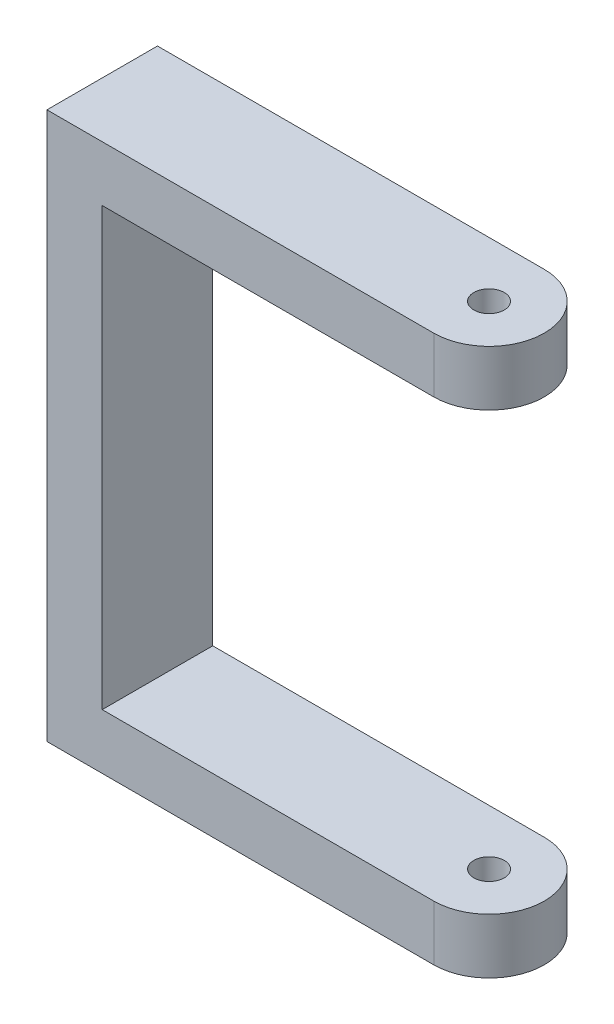
ISO-10303-21;
HEADER;
FILE_DESCRIPTION(('STEP AP214'),'2;1');
FILE_NAME('part.step','',(''),(''),'','','');
FILE_SCHEMA(('AUTOMOTIVE_DESIGN { 1 0 10303 214 1 1 1 1 }'));
ENDSEC;
DATA;
#1=APPLICATION_CONTEXT('core data for automotive mechanical design processes');
#2=APPLICATION_PROTOCOL_DEFINITION('international standard','automotive_design',2000,#1);
#3=PRODUCT_CONTEXT('',#1,'mechanical');
#4=PRODUCT('Part','Part','',(#3));
#5=PRODUCT_RELATED_PRODUCT_CATEGORY('part','',(#4));
#6=PRODUCT_DEFINITION_FORMATION('','',#4);
#7=PRODUCT_DEFINITION_CONTEXT('part definition',#1,'design');
#8=PRODUCT_DEFINITION('design','',#6,#7);
#9=PRODUCT_DEFINITION_SHAPE('','',#8);
#10=(LENGTH_UNIT() NAMED_UNIT(*) SI_UNIT(.MILLI.,.METRE.));
#11=(NAMED_UNIT(*) PLANE_ANGLE_UNIT() SI_UNIT($,.RADIAN.));
#12=(NAMED_UNIT(*) SI_UNIT($,.STERADIAN.) SOLID_ANGLE_UNIT());
#13=UNCERTAINTY_MEASURE_WITH_UNIT(LENGTH_MEASURE(1.E-05),#10,'distance_accuracy_value','');
#14=(GEOMETRIC_REPRESENTATION_CONTEXT(3) GLOBAL_UNCERTAINTY_ASSIGNED_CONTEXT((#13)) GLOBAL_UNIT_ASSIGNED_CONTEXT((#10,
#11,#12)) REPRESENTATION_CONTEXT('',''));
#15=CARTESIAN_POINT('',(0.,0.,0.));
#16=DIRECTION('',(0.,0.,1.));
#17=DIRECTION('',(1.,0.,0.));
#18=AXIS2_PLACEMENT_3D('',#15,#16,#17);
#19=CARTESIAN_POINT('',(70.,49.5,20.));
#20=DIRECTION('',(0.,-1.,0.));
#21=DIRECTION('',(1.,0.,0.));
#22=AXIS2_PLACEMENT_3D('',#19,#20,#21);
#23=PLANE('',#22);
#24=CARTESIAN_POINT('',(60.,49.5,10.));
#25=DIRECTION('',(0.,1.,0.));
#26=DIRECTION('',(-1.,0.,0.));
#27=AXIS2_PLACEMENT_3D('',#24,#25,#26);
#28=CIRCLE('',#27,2.75);
#29=CARTESIAN_POINT('',(57.25,49.5,10.));
#30=VERTEX_POINT('',#29);
#31=EDGE_CURVE('E220',#30,#30,#28,.T.);
#32=ORIENTED_EDGE('',*,*,#31,.F.);
#33=EDGE_LOOP('',(#32));
#34=FACE_BOUND('',#33,.T.);
#35=DIRECTION('',(-1.,0.,0.));
#36=VECTOR('',#35,1.);
#37=CARTESIAN_POINT('',(70.,49.5,20.));
#38=LINE('',#37,#36);
#39=CARTESIAN_POINT('',(60.,49.5,20.));
#40=VERTEX_POINT('',#39);
#41=CARTESIAN_POINT('',(-9.99999999999999,49.5,20.));
#42=VERTEX_POINT('',#41);
#43=EDGE_CURVE('E166',#40,#42,#38,.T.);
#44=ORIENTED_EDGE('',*,*,#43,.F.);
#45=CARTESIAN_POINT('',(60.,49.5,10.));
#46=DIRECTION('',(0.,1.,0.));
#47=DIRECTION('',(-1.,0.,0.));
#48=AXIS2_PLACEMENT_3D('',#45,#46,#47);
#49=CIRCLE('',#48,10.);
#50=CARTESIAN_POINT('',(60.,49.5,0.));
#51=VERTEX_POINT('',#50);
#52=EDGE_CURVE('E148',#40,#51,#49,.T.);
#53=ORIENTED_EDGE('',*,*,#52,.T.);
#54=DIRECTION('',(-1.,0.,0.));
#55=VECTOR('',#54,1.);
#56=CARTESIAN_POINT('',(70.,49.5,0.));
#57=LINE('',#56,#55);
#58=CARTESIAN_POINT('',(-9.99999999999999,49.5,0.));
#59=VERTEX_POINT('',#58);
#60=EDGE_CURVE('E175',#51,#59,#57,.T.);
#61=ORIENTED_EDGE('',*,*,#60,.T.);
#62=DIRECTION('',(0.,0.,-1.));
#63=VECTOR('',#62,1.);
#64=CARTESIAN_POINT('',(-9.99999999999999,49.5,20.));
#65=LINE('',#64,#63);
#66=EDGE_CURVE('E195',#42,#59,#65,.T.);
#67=ORIENTED_EDGE('',*,*,#66,.F.);
#68=EDGE_LOOP('',(#44,#53,#61,#67));
#69=FACE_BOUND('',#68,.T.);
#70=ADVANCED_FACE('F77',(#34,#69),#23,.F.);
#71=CARTESIAN_POINT('',(-9.99999999999999,-49.5,20.));
#72=DIRECTION('',(0.,1.,0.));
#73=DIRECTION('',(-1.,0.,0.));
#74=AXIS2_PLACEMENT_3D('',#71,#72,#73);
#75=PLANE('',#74);
#76=CARTESIAN_POINT('',(60.,-49.5,10.));
#77=DIRECTION('',(0.,1.,0.));
#78=DIRECTION('',(-1.,0.,0.));
#79=AXIS2_PLACEMENT_3D('',#76,#77,#78);
#80=CIRCLE('',#79,2.75);
#81=CARTESIAN_POINT('',(57.25,-49.5,10.));
#82=VERTEX_POINT('',#81);
#83=EDGE_CURVE('E205',#82,#82,#80,.T.);
#84=ORIENTED_EDGE('',*,*,#83,.T.);
#85=EDGE_LOOP('',(#84));
#86=FACE_BOUND('',#85,.T.);
#87=CARTESIAN_POINT('',(60.,-49.5,10.));
#88=DIRECTION('',(0.,1.,0.));
#89=DIRECTION('',(-1.,0.,0.));
#90=AXIS2_PLACEMENT_3D('',#87,#88,#89);
#91=CIRCLE('',#90,10.);
#92=CARTESIAN_POINT('',(60.,-49.5,20.));
#93=VERTEX_POINT('',#92);
#94=CARTESIAN_POINT('',(60.,-49.5,0.));
#95=VERTEX_POINT('',#94);
#96=EDGE_CURVE('E91',#93,#95,#91,.T.);
#97=ORIENTED_EDGE('',*,*,#96,.F.);
#98=DIRECTION('',(1.,0.,0.));
#99=VECTOR('',#98,1.);
#100=CARTESIAN_POINT('',(-9.99999999999999,-49.5,20.));
#101=LINE('',#100,#99);
#102=CARTESIAN_POINT('',(-9.99999999999999,-49.5,20.));
#103=VERTEX_POINT('',#102);
#104=EDGE_CURVE('E144',#103,#93,#101,.T.);
#105=ORIENTED_EDGE('',*,*,#104,.F.);
#106=DIRECTION('',(0.,0.,-1.));
#107=VECTOR('',#106,1.);
#108=CARTESIAN_POINT('',(-9.99999999999999,-49.5,20.));
#109=LINE('',#108,#107);
#110=CARTESIAN_POINT('',(-9.99999999999999,-49.5,0.));
#111=VERTEX_POINT('',#110);
#112=EDGE_CURVE('E193',#103,#111,#109,.T.);
#113=ORIENTED_EDGE('',*,*,#112,.T.);
#114=DIRECTION('',(1.,0.,0.));
#115=VECTOR('',#114,1.);
#116=CARTESIAN_POINT('',(-9.99999999999999,-49.5,0.));
#117=LINE('',#116,#115);
#118=EDGE_CURVE('E146',#111,#95,#117,.T.);
#119=ORIENTED_EDGE('',*,*,#118,.T.);
#120=EDGE_LOOP('',(#97,#105,#113,#119));
#121=FACE_BOUND('',#120,.T.);
#122=ADVANCED_FACE('F141',(#86,#121),#75,.F.);
#123=CARTESIAN_POINT('',(70.,-39.5,20.));
#124=DIRECTION('',(0.,-1.,0.));
#125=DIRECTION('',(1.,0.,0.));
#126=AXIS2_PLACEMENT_3D('',#123,#124,#125);
#127=PLANE('',#126);
#128=CARTESIAN_POINT('',(60.,-39.5,10.));
#129=DIRECTION('',(0.,-1.,0.));
#130=DIRECTION('',(1.,0.,0.));
#131=AXIS2_PLACEMENT_3D('',#128,#129,#130);
#132=CIRCLE('',#131,2.75);
#133=CARTESIAN_POINT('',(62.75,-39.5,10.));
#134=VERTEX_POINT('',#133);
#135=EDGE_CURVE('E178',#134,#134,#132,.T.);
#136=ORIENTED_EDGE('',*,*,#135,.T.);
#137=EDGE_LOOP('',(#136));
#138=FACE_BOUND('',#137,.T.);
#139=DIRECTION('',(-1.,0.,0.));
#140=VECTOR('',#139,1.);
#141=CARTESIAN_POINT('',(70.,-39.5,20.));
#142=LINE('',#141,#140);
#143=CARTESIAN_POINT('',(60.,-39.5,20.));
#144=VERTEX_POINT('',#143);
#145=CARTESIAN_POINT('',(0.,-39.5,20.));
#146=VERTEX_POINT('',#145);
#147=EDGE_CURVE('E162',#144,#146,#142,.T.);
#148=ORIENTED_EDGE('',*,*,#147,.F.);
#149=CARTESIAN_POINT('',(60.,-39.5,10.));
#150=DIRECTION('',(0.,-1.,0.));
#151=DIRECTION('',(1.,0.,0.));
#152=AXIS2_PLACEMENT_3D('',#149,#150,#151);
#153=CIRCLE('',#152,10.);
#154=CARTESIAN_POINT('',(60.,-39.5,0.));
#155=VERTEX_POINT('',#154);
#156=EDGE_CURVE('E154',#155,#144,#153,.T.);
#157=ORIENTED_EDGE('',*,*,#156,.F.);
#158=DIRECTION('',(-1.,0.,0.));
#159=VECTOR('',#158,1.);
#160=CARTESIAN_POINT('',(70.,-39.5,0.));
#161=LINE('',#160,#159);
#162=CARTESIAN_POINT('',(0.,-39.5,0.));
#163=VERTEX_POINT('',#162);
#164=EDGE_CURVE('E181',#155,#163,#161,.T.);
#165=ORIENTED_EDGE('',*,*,#164,.T.);
#166=DIRECTION('',(0.,0.,-1.));
#167=VECTOR('',#166,1.);
#168=CARTESIAN_POINT('',(0.,-39.5,20.));
#169=LINE('',#168,#167);
#170=EDGE_CURVE('E190',#146,#163,#169,.T.);
#171=ORIENTED_EDGE('',*,*,#170,.F.);
#172=EDGE_LOOP('',(#148,#157,#165,#171));
#173=FACE_BOUND('',#172,.T.);
#174=ADVANCED_FACE('F236',(#138,#173),#127,.F.);
#175=CARTESIAN_POINT('',(0.,39.5,20.));
#176=DIRECTION('',(0.,1.,0.));
#177=DIRECTION('',(0.,0.,1.));
#178=AXIS2_PLACEMENT_3D('',#175,#176,#177);
#179=PLANE('',#178);
#180=CARTESIAN_POINT('',(60.,39.5,10.));
#181=DIRECTION('',(0.,1.,0.));
#182=DIRECTION('',(0.,0.,1.));
#183=AXIS2_PLACEMENT_3D('',#180,#181,#182);
#184=CIRCLE('',#183,2.75);
#185=CARTESIAN_POINT('',(60.,39.5,12.75));
#186=VERTEX_POINT('',#185);
#187=EDGE_CURVE('E198',#186,#186,#184,.T.);
#188=ORIENTED_EDGE('',*,*,#187,.T.);
#189=EDGE_LOOP('',(#188));
#190=FACE_BOUND('',#189,.T.);
#191=CARTESIAN_POINT('',(60.,39.5,10.));
#192=DIRECTION('',(0.,1.,0.));
#193=DIRECTION('',(0.,0.,1.));
#194=AXIS2_PLACEMENT_3D('',#191,#192,#193);
#195=CIRCLE('',#194,10.);
#196=CARTESIAN_POINT('',(60.,39.5,20.));
#197=VERTEX_POINT('',#196);
#198=CARTESIAN_POINT('',(60.,39.5,0.));
#199=VERTEX_POINT('',#198);
#200=EDGE_CURVE('E99',#197,#199,#195,.T.);
#201=ORIENTED_EDGE('',*,*,#200,.F.);
#202=DIRECTION('',(1.,0.,0.));
#203=VECTOR('',#202,1.);
#204=CARTESIAN_POINT('',(0.,39.5,20.));
#205=LINE('',#204,#203);
#206=CARTESIAN_POINT('',(0.,39.5,20.));
#207=VERTEX_POINT('',#206);
#208=EDGE_CURVE('E171',#207,#197,#205,.T.);
#209=ORIENTED_EDGE('',*,*,#208,.F.);
#210=DIRECTION('',(0.,0.,-1.));
#211=VECTOR('',#210,1.);
#212=CARTESIAN_POINT('',(0.,39.5,20.));
#213=LINE('',#212,#211);
#214=CARTESIAN_POINT('',(0.,39.5,0.));
#215=VERTEX_POINT('',#214);
#216=EDGE_CURVE('E174',#207,#215,#213,.T.);
#217=ORIENTED_EDGE('',*,*,#216,.T.);
#218=DIRECTION('',(1.,0.,0.));
#219=VECTOR('',#218,1.);
#220=CARTESIAN_POINT('',(0.,39.5,0.));
#221=LINE('',#220,#219);
#222=EDGE_CURVE('E185',#215,#199,#221,.T.);
#223=ORIENTED_EDGE('',*,*,#222,.T.);
#224=EDGE_LOOP('',(#201,#209,#217,#223));
#225=FACE_BOUND('',#224,.T.);
#226=ADVANCED_FACE('F239',(#190,#225),#179,.F.);
#227=CARTESIAN_POINT('',(0.,0.,20.));
#228=DIRECTION('',(0.,0.,1.));
#229=DIRECTION('',(1.,0.,0.));
#230=AXIS2_PLACEMENT_3D('',#227,#228,#229);
#231=PLANE('',#230);
#232=ORIENTED_EDGE('',*,*,#104,.T.);
#233=DIRECTION('',(0.,1.,0.));
#234=VECTOR('',#233,1.);
#235=CARTESIAN_POINT('',(60.,-49.5,20.));
#236=LINE('',#235,#234);
#237=EDGE_CURVE('E151',#93,#144,#236,.T.);
#238=ORIENTED_EDGE('',*,*,#237,.T.);
#239=ORIENTED_EDGE('',*,*,#147,.T.);
#240=DIRECTION('',(0.,1.,0.));
#241=VECTOR('',#240,1.);
#242=CARTESIAN_POINT('',(0.,39.5,20.));
#243=LINE('',#242,#241);
#244=EDGE_CURVE('E164',#146,#207,#243,.T.);
#245=ORIENTED_EDGE('',*,*,#244,.T.);
#246=ORIENTED_EDGE('',*,*,#208,.T.);
#247=DIRECTION('',(0.,1.,0.));
#248=VECTOR('',#247,1.);
#249=CARTESIAN_POINT('',(60.,-49.5,20.));
#250=LINE('',#249,#248);
#251=EDGE_CURVE('E12',#197,#40,#250,.T.);
#252=ORIENTED_EDGE('',*,*,#251,.T.);
#253=ORIENTED_EDGE('',*,*,#43,.T.);
#254=DIRECTION('',(0.,-1.,0.));
#255=VECTOR('',#254,1.);
#256=CARTESIAN_POINT('',(-9.99999999999999,49.5,20.));
#257=LINE('',#256,#255);
#258=EDGE_CURVE('E160',#42,#103,#257,.T.);
#259=ORIENTED_EDGE('',*,*,#258,.T.);
#260=EDGE_LOOP('',(#232,#238,#239,#245,#246,#252,#253,#259));
#261=FACE_BOUND('',#260,.T.);
#262=ADVANCED_FACE('F158',(#261),#231,.T.);
#263=CARTESIAN_POINT('',(0.,0.,0.));
#264=DIRECTION('',(0.,0.,1.));
#265=DIRECTION('',(1.,0.,0.));
#266=AXIS2_PLACEMENT_3D('',#263,#264,#265);
#267=PLANE('',#266);
#268=DIRECTION('',(0.,1.,0.));
#269=VECTOR('',#268,1.);
#270=CARTESIAN_POINT('',(60.,-49.5,0.));
#271=LINE('',#270,#269);
#272=EDGE_CURVE('E147',#95,#155,#271,.T.);
#273=ORIENTED_EDGE('',*,*,#272,.F.);
#274=ORIENTED_EDGE('',*,*,#118,.F.);
#275=DIRECTION('',(0.,-1.,0.));
#276=VECTOR('',#275,1.);
#277=CARTESIAN_POINT('',(-9.99999999999999,49.5,0.));
#278=LINE('',#277,#276);
#279=EDGE_CURVE('E177',#59,#111,#278,.T.);
#280=ORIENTED_EDGE('',*,*,#279,.F.);
#281=ORIENTED_EDGE('',*,*,#60,.F.);
#282=DIRECTION('',(0.,1.,0.));
#283=VECTOR('',#282,1.);
#284=CARTESIAN_POINT('',(60.,-49.5,0.));
#285=LINE('',#284,#283);
#286=EDGE_CURVE('E84',#199,#51,#285,.T.);
#287=ORIENTED_EDGE('',*,*,#286,.F.);
#288=ORIENTED_EDGE('',*,*,#222,.F.);
#289=DIRECTION('',(0.,1.,0.));
#290=VECTOR('',#289,1.);
#291=CARTESIAN_POINT('',(0.,39.5,0.));
#292=LINE('',#291,#290);
#293=EDGE_CURVE('E183',#163,#215,#292,.T.);
#294=ORIENTED_EDGE('',*,*,#293,.F.);
#295=ORIENTED_EDGE('',*,*,#164,.F.);
#296=EDGE_LOOP('',(#273,#274,#280,#281,#287,#288,#294,#295));
#297=FACE_BOUND('',#296,.T.);
#298=ADVANCED_FACE('F217',(#297),#267,.F.);
#299=CARTESIAN_POINT('',(-9.99999999999999,49.5,20.));
#300=DIRECTION('',(1.,0.,0.));
#301=DIRECTION('',(0.,1.,0.));
#302=AXIS2_PLACEMENT_3D('',#299,#300,#301);
#303=PLANE('',#302);
#304=ORIENTED_EDGE('',*,*,#279,.T.);
#305=ORIENTED_EDGE('',*,*,#112,.F.);
#306=ORIENTED_EDGE('',*,*,#258,.F.);
#307=ORIENTED_EDGE('',*,*,#66,.T.);
#308=EDGE_LOOP('',(#304,#305,#306,#307));
#309=FACE_BOUND('',#308,.T.);
#310=ADVANCED_FACE('F215',(#309),#303,.F.);
#311=CARTESIAN_POINT('',(0.,39.5,20.));
#312=DIRECTION('',(-1.,0.,0.));
#313=DIRECTION('',(0.,0.,1.));
#314=AXIS2_PLACEMENT_3D('',#311,#312,#313);
#315=PLANE('',#314);
#316=ORIENTED_EDGE('',*,*,#293,.T.);
#317=ORIENTED_EDGE('',*,*,#216,.F.);
#318=ORIENTED_EDGE('',*,*,#244,.F.);
#319=ORIENTED_EDGE('',*,*,#170,.T.);
#320=EDGE_LOOP('',(#316,#317,#318,#319));
#321=FACE_BOUND('',#320,.T.);
#322=ADVANCED_FACE('F246',(#321),#315,.F.);
#323=CARTESIAN_POINT('',(60.,-49.5,10.));
#324=DIRECTION('',(0.,1.,0.));
#325=DIRECTION('',(-1.,0.,0.));
#326=AXIS2_PLACEMENT_3D('',#323,#324,#325);
#327=CYLINDRICAL_SURFACE('',#326,10.);
#328=ORIENTED_EDGE('',*,*,#200,.T.);
#329=ORIENTED_EDGE('',*,*,#286,.T.);
#330=ORIENTED_EDGE('',*,*,#52,.F.);
#331=ORIENTED_EDGE('',*,*,#251,.F.);
#332=EDGE_LOOP('',(#328,#329,#330,#331));
#333=FACE_BOUND('',#332,.T.);
#334=ADVANCED_FACE('F249',(#333),#327,.T.);
#335=ORIENTED_EDGE('',*,*,#156,.T.);
#336=ORIENTED_EDGE('',*,*,#237,.F.);
#337=ORIENTED_EDGE('',*,*,#96,.T.);
#338=ORIENTED_EDGE('',*,*,#272,.T.);
#339=EDGE_LOOP('',(#335,#336,#337,#338));
#340=FACE_BOUND('',#339,.T.);
#341=ADVANCED_FACE('F152',(#340),#327,.T.);
#342=CARTESIAN_POINT('',(60.,-49.5,10.));
#343=DIRECTION('',(0.,1.,0.));
#344=DIRECTION('',(-1.,0.,0.));
#345=AXIS2_PLACEMENT_3D('',#342,#343,#344);
#346=CYLINDRICAL_SURFACE('',#345,2.75);
#347=ORIENTED_EDGE('',*,*,#31,.T.);
#348=EDGE_LOOP('',(#347));
#349=FACE_BOUND('',#348,.T.);
#350=ORIENTED_EDGE('',*,*,#187,.F.);
#351=EDGE_LOOP('',(#350));
#352=FACE_BOUND('',#351,.T.);
#353=ADVANCED_FACE('F232',(#349,#352),#346,.F.);
#354=ORIENTED_EDGE('',*,*,#83,.F.);
#355=EDGE_LOOP('',(#354));
#356=FACE_BOUND('',#355,.T.);
#357=ORIENTED_EDGE('',*,*,#135,.F.);
#358=EDGE_LOOP('',(#357));
#359=FACE_BOUND('',#358,.T.);
#360=ADVANCED_FACE('F229',(#356,#359),#346,.F.);
#361=CLOSED_SHELL('',(#70,#122,#174,#226,#262,#298,#310,#322,#334,#341,#353,#360));
#362=MANIFOLD_SOLID_BREP('B2',#361);
#363=ADVANCED_BREP_SHAPE_REPRESENTATION('',(#18,#362),#14);
#364=SHAPE_DEFINITION_REPRESENTATION(#9,#363);
ENDSEC;
END-ISO-10303-21;
